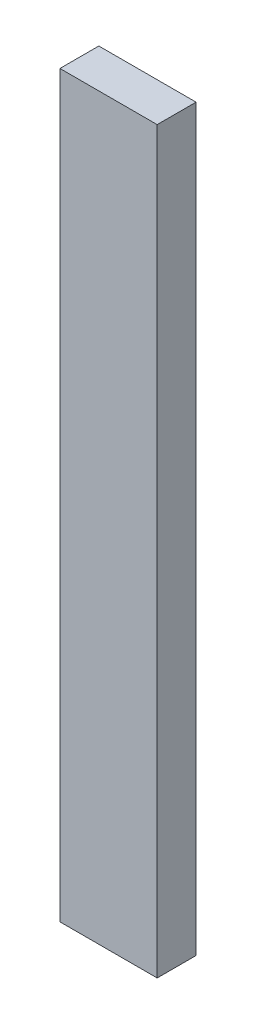
ISO-10303-21;
HEADER;
FILE_DESCRIPTION(('STEP AP214'),'2;1');
FILE_NAME('part.step','',(''),(''),'','','');
FILE_SCHEMA(('AUTOMOTIVE_DESIGN { 1 0 10303 214 1 1 1 1 }'));
ENDSEC;
DATA;
#1=APPLICATION_CONTEXT('core data for automotive mechanical design processes');
#2=APPLICATION_PROTOCOL_DEFINITION('international standard','automotive_design',2000,#1);
#3=PRODUCT_CONTEXT('',#1,'mechanical');
#4=PRODUCT('Part','Part','',(#3));
#5=PRODUCT_RELATED_PRODUCT_CATEGORY('part','',(#4));
#6=PRODUCT_DEFINITION_FORMATION('','',#4);
#7=PRODUCT_DEFINITION_CONTEXT('part definition',#1,'design');
#8=PRODUCT_DEFINITION('design','',#6,#7);
#9=PRODUCT_DEFINITION_SHAPE('','',#8);
#10=(LENGTH_UNIT() NAMED_UNIT(*) SI_UNIT(.MILLI.,.METRE.));
#11=(NAMED_UNIT(*) PLANE_ANGLE_UNIT() SI_UNIT($,.RADIAN.));
#12=(NAMED_UNIT(*) SI_UNIT($,.STERADIAN.) SOLID_ANGLE_UNIT());
#13=UNCERTAINTY_MEASURE_WITH_UNIT(LENGTH_MEASURE(1.E-05),#10,'distance_accuracy_value','');
#14=(GEOMETRIC_REPRESENTATION_CONTEXT(3) GLOBAL_UNCERTAINTY_ASSIGNED_CONTEXT((#13)) GLOBAL_UNIT_ASSIGNED_CONTEXT((#10,
#11,#12)) REPRESENTATION_CONTEXT('',''));
#15=CARTESIAN_POINT('',(0.,0.,0.));
#16=DIRECTION('',(0.,0.,1.));
#17=DIRECTION('',(1.,0.,0.));
#18=AXIS2_PLACEMENT_3D('',#15,#16,#17);
#19=CARTESIAN_POINT('',(-0.25,-1.425,2.18));
#20=DIRECTION('',(0.,0.,1.));
#21=DIRECTION('',(1.,0.,0.));
#22=AXIS2_PLACEMENT_3D('',#19,#20,#21);
#23=PLANE('',#22);
#24=DIRECTION('',(0.,1.,0.));
#25=VECTOR('',#24,1.);
#26=CARTESIAN_POINT('',(-0.375,-2.375,2.18));
#27=LINE('',#26,#25);
#28=CARTESIAN_POINT('',(-0.375,-2.375,2.18));
#29=VERTEX_POINT('',#28);
#30=CARTESIAN_POINT('',(-0.375,-0.475,2.18));
#31=VERTEX_POINT('',#30);
#32=EDGE_CURVE('E25',#29,#31,#27,.T.);
#33=ORIENTED_EDGE('',*,*,#32,.F.);
#34=DIRECTION('',(-1.,0.,0.));
#35=VECTOR('',#34,1.);
#36=CARTESIAN_POINT('',(-0.125,-2.375,2.18));
#37=LINE('',#36,#35);
#38=CARTESIAN_POINT('',(-0.125,-2.375,2.18));
#39=VERTEX_POINT('',#38);
#40=EDGE_CURVE('E104',#39,#29,#37,.T.);
#41=ORIENTED_EDGE('',*,*,#40,.F.);
#42=DIRECTION('',(0.,-1.,0.));
#43=VECTOR('',#42,1.);
#44=CARTESIAN_POINT('',(-0.125,-0.475,2.18));
#45=LINE('',#44,#43);
#46=CARTESIAN_POINT('',(-0.125,-0.475,2.18));
#47=VERTEX_POINT('',#46);
#48=EDGE_CURVE('E83',#47,#39,#45,.T.);
#49=ORIENTED_EDGE('',*,*,#48,.F.);
#50=DIRECTION('',(1.,0.,0.));
#51=VECTOR('',#50,1.);
#52=CARTESIAN_POINT('',(-0.375,-0.475,2.18));
#53=LINE('',#52,#51);
#54=EDGE_CURVE('E87',#31,#47,#53,.T.);
#55=ORIENTED_EDGE('',*,*,#54,.F.);
#56=EDGE_LOOP('',(#33,#41,#49,#55));
#57=FACE_BOUND('',#56,.T.);
#58=ADVANCED_FACE('F17',(#57),#23,.T.);
#59=CARTESIAN_POINT('',(-0.25,-1.425,2.08));
#60=DIRECTION('',(0.,0.,1.));
#61=DIRECTION('',(1.,0.,0.));
#62=AXIS2_PLACEMENT_3D('',#59,#60,#61);
#63=PLANE('',#62);
#64=DIRECTION('',(1.,0.,0.));
#65=VECTOR('',#64,1.);
#66=CARTESIAN_POINT('',(-0.375,-0.475,2.08));
#67=LINE('',#66,#65);
#68=CARTESIAN_POINT('',(-0.375,-0.475,2.08));
#69=VERTEX_POINT('',#68);
#70=CARTESIAN_POINT('',(-0.125,-0.475,2.08));
#71=VERTEX_POINT('',#70);
#72=EDGE_CURVE('E75',#69,#71,#67,.T.);
#73=ORIENTED_EDGE('',*,*,#72,.T.);
#74=DIRECTION('',(0.,-1.,0.));
#75=VECTOR('',#74,1.);
#76=CARTESIAN_POINT('',(-0.125,-0.475,2.08));
#77=LINE('',#76,#75);
#78=CARTESIAN_POINT('',(-0.125,-2.375,2.08));
#79=VERTEX_POINT('',#78);
#80=EDGE_CURVE('E100',#71,#79,#77,.T.);
#81=ORIENTED_EDGE('',*,*,#80,.T.);
#82=DIRECTION('',(-1.,0.,0.));
#83=VECTOR('',#82,1.);
#84=CARTESIAN_POINT('',(-0.125,-2.375,2.08));
#85=LINE('',#84,#83);
#86=CARTESIAN_POINT('',(-0.375,-2.375,2.08));
#87=VERTEX_POINT('',#86);
#88=EDGE_CURVE('E73',#79,#87,#85,.T.);
#89=ORIENTED_EDGE('',*,*,#88,.T.);
#90=DIRECTION('',(0.,1.,0.));
#91=VECTOR('',#90,1.);
#92=CARTESIAN_POINT('',(-0.375,-2.375,2.08));
#93=LINE('',#92,#91);
#94=EDGE_CURVE('E11',#87,#69,#93,.T.);
#95=ORIENTED_EDGE('',*,*,#94,.T.);
#96=EDGE_LOOP('',(#73,#81,#89,#95));
#97=FACE_BOUND('',#96,.T.);
#98=ADVANCED_FACE('F67',(#97),#63,.F.);
#99=CARTESIAN_POINT('',(-0.375,-2.375,2.08));
#100=DIRECTION('',(-1.,0.,0.));
#101=DIRECTION('',(0.,0.,1.));
#102=AXIS2_PLACEMENT_3D('',#99,#100,#101);
#103=PLANE('',#102);
#104=DIRECTION('',(0.,0.,1.));
#105=VECTOR('',#104,1.);
#106=CARTESIAN_POINT('',(-0.375,-2.375,2.08));
#107=LINE('',#106,#105);
#108=EDGE_CURVE('E106',#87,#29,#107,.T.);
#109=ORIENTED_EDGE('',*,*,#108,.T.);
#110=ORIENTED_EDGE('',*,*,#32,.T.);
#111=DIRECTION('',(0.,0.,1.));
#112=VECTOR('',#111,1.);
#113=CARTESIAN_POINT('',(-0.375,-0.475,2.08));
#114=LINE('',#113,#112);
#115=EDGE_CURVE('E78',#69,#31,#114,.T.);
#116=ORIENTED_EDGE('',*,*,#115,.F.);
#117=ORIENTED_EDGE('',*,*,#94,.F.);
#118=EDGE_LOOP('',(#109,#110,#116,#117));
#119=FACE_BOUND('',#118,.T.);
#120=ADVANCED_FACE('F84',(#119),#103,.T.);
#121=CARTESIAN_POINT('',(-0.125,-2.375,2.08));
#122=DIRECTION('',(0.,-1.,0.));
#123=DIRECTION('',(0.,0.,-1.));
#124=AXIS2_PLACEMENT_3D('',#121,#122,#123);
#125=PLANE('',#124);
#126=DIRECTION('',(0.,0.,1.));
#127=VECTOR('',#126,1.);
#128=CARTESIAN_POINT('',(-0.125,-2.375,2.08));
#129=LINE('',#128,#127);
#130=EDGE_CURVE('E92',#79,#39,#129,.T.);
#131=ORIENTED_EDGE('',*,*,#130,.T.);
#132=ORIENTED_EDGE('',*,*,#40,.T.);
#133=ORIENTED_EDGE('',*,*,#108,.F.);
#134=ORIENTED_EDGE('',*,*,#88,.F.);
#135=EDGE_LOOP('',(#131,#132,#133,#134));
#136=FACE_BOUND('',#135,.T.);
#137=ADVANCED_FACE('F129',(#136),#125,.T.);
#138=CARTESIAN_POINT('',(-0.125,-0.475,2.08));
#139=DIRECTION('',(1.,0.,0.));
#140=DIRECTION('',(0.,1.,0.));
#141=AXIS2_PLACEMENT_3D('',#138,#139,#140);
#142=PLANE('',#141);
#143=DIRECTION('',(0.,0.,1.));
#144=VECTOR('',#143,1.);
#145=CARTESIAN_POINT('',(-0.125,-0.475,2.08));
#146=LINE('',#145,#144);
#147=EDGE_CURVE('E81',#71,#47,#146,.T.);
#148=ORIENTED_EDGE('',*,*,#147,.T.);
#149=ORIENTED_EDGE('',*,*,#48,.T.);
#150=ORIENTED_EDGE('',*,*,#130,.F.);
#151=ORIENTED_EDGE('',*,*,#80,.F.);
#152=EDGE_LOOP('',(#148,#149,#150,#151));
#153=FACE_BOUND('',#152,.T.);
#154=ADVANCED_FACE('F125',(#153),#142,.T.);
#155=CARTESIAN_POINT('',(-0.375,-0.475,2.08));
#156=DIRECTION('',(0.,1.,0.));
#157=DIRECTION('',(1.,0.,0.));
#158=AXIS2_PLACEMENT_3D('',#155,#156,#157);
#159=PLANE('',#158);
#160=ORIENTED_EDGE('',*,*,#115,.T.);
#161=ORIENTED_EDGE('',*,*,#54,.T.);
#162=ORIENTED_EDGE('',*,*,#147,.F.);
#163=ORIENTED_EDGE('',*,*,#72,.F.);
#164=EDGE_LOOP('',(#160,#161,#162,#163));
#165=FACE_BOUND('',#164,.T.);
#166=ADVANCED_FACE('F80',(#165),#159,.T.);
#167=CLOSED_SHELL('',(#58,#98,#120,#137,#154,#166));
#168=MANIFOLD_SOLID_BREP('B1',#167);
#169=ADVANCED_BREP_SHAPE_REPRESENTATION('',(#18,#168),#14);
#170=SHAPE_DEFINITION_REPRESENTATION(#9,#169);
ENDSEC;
END-ISO-10303-21;
